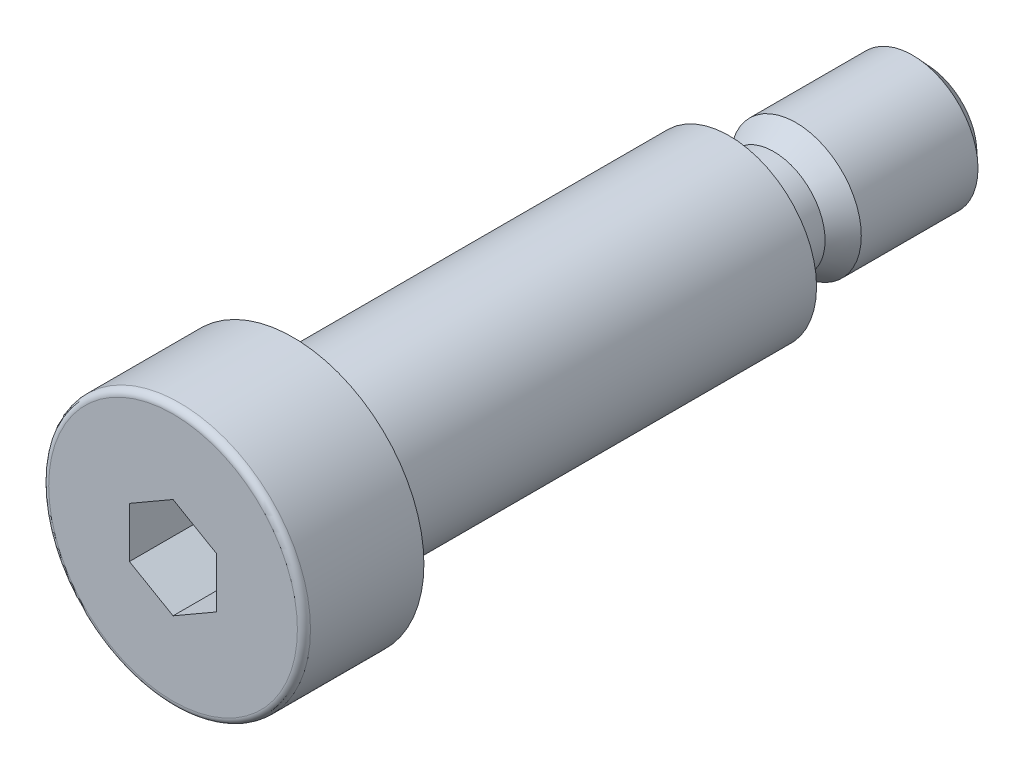
ISO-10303-21;
HEADER;
FILE_DESCRIPTION(('STEP AP214'),'2;1');
FILE_NAME('part.step','',(''),(''),'','','');
FILE_SCHEMA(('AUTOMOTIVE_DESIGN { 1 0 10303 214 1 1 1 1 }'));
ENDSEC;
DATA;
#1=APPLICATION_CONTEXT('core data for automotive mechanical design processes');
#2=APPLICATION_PROTOCOL_DEFINITION('international standard','automotive_design',2000,#1);
#3=PRODUCT_CONTEXT('',#1,'mechanical');
#4=PRODUCT('Part','Part','',(#3));
#5=PRODUCT_RELATED_PRODUCT_CATEGORY('part','',(#4));
#6=PRODUCT_DEFINITION_FORMATION('','',#4);
#7=PRODUCT_DEFINITION_CONTEXT('part definition',#1,'design');
#8=PRODUCT_DEFINITION('design','',#6,#7);
#9=PRODUCT_DEFINITION_SHAPE('','',#8);
#10=(LENGTH_UNIT() NAMED_UNIT(*) SI_UNIT(.MILLI.,.METRE.));
#11=(NAMED_UNIT(*) PLANE_ANGLE_UNIT() SI_UNIT($,.RADIAN.));
#12=(NAMED_UNIT(*) SI_UNIT($,.STERADIAN.) SOLID_ANGLE_UNIT());
#13=UNCERTAINTY_MEASURE_WITH_UNIT(LENGTH_MEASURE(1.E-05),#10,'distance_accuracy_value','');
#14=(GEOMETRIC_REPRESENTATION_CONTEXT(3) GLOBAL_UNCERTAINTY_ASSIGNED_CONTEXT((#13)) GLOBAL_UNIT_ASSIGNED_CONTEXT((#10,
#11,#12)) REPRESENTATION_CONTEXT('',''));
#15=CARTESIAN_POINT('',(0.,0.,0.));
#16=DIRECTION('',(0.,0.,1.));
#17=DIRECTION('',(1.,0.,0.));
#18=AXIS2_PLACEMENT_3D('',#15,#16,#17);
#19=CARTESIAN_POINT('',(0.,0.,31.));
#20=DIRECTION('',(0.,0.,1.));
#21=DIRECTION('',(1.,0.,0.));
#22=AXIS2_PLACEMENT_3D('',#19,#20,#21);
#23=PLANE('',#22);
#24=CARTESIAN_POINT('',(0.,0.,31.));
#25=DIRECTION('',(0.,0.,1.));
#26=DIRECTION('',(1.,0.,0.));
#27=AXIS2_PLACEMENT_3D('',#24,#25,#26);
#28=CIRCLE('',#27,11.4);
#29=CARTESIAN_POINT('',(11.4,0.,31.));
#30=VERTEX_POINT('',#29);
#31=EDGE_CURVE('E43',#30,#30,#28,.T.);
#32=ORIENTED_EDGE('',*,*,#31,.T.);
#33=EDGE_LOOP('',(#32));
#34=FACE_BOUND('',#33,.T.);
#35=DIRECTION('',(0.,1.,0.));
#36=VECTOR('',#35,1.);
#37=CARTESIAN_POINT('',(4.,-2.30940107675851,31.));
#38=LINE('',#37,#36);
#39=CARTESIAN_POINT('',(4.,-2.30940107675851,31.));
#40=VERTEX_POINT('',#39);
#41=CARTESIAN_POINT('',(4.,2.3094010767585,31.));
#42=VERTEX_POINT('',#41);
#43=EDGE_CURVE('E50',#40,#42,#38,.T.);
#44=ORIENTED_EDGE('',*,*,#43,.F.);
#45=DIRECTION('',(0.866025403784439,0.5,0.));
#46=VECTOR('',#45,1.);
#47=CARTESIAN_POINT('',(0.,-4.61880215351701,31.));
#48=LINE('',#47,#46);
#49=CARTESIAN_POINT('',(0.,-4.61880215351701,31.));
#50=VERTEX_POINT('',#49);
#51=EDGE_CURVE('E133',#50,#40,#48,.T.);
#52=ORIENTED_EDGE('',*,*,#51,.F.);
#53=DIRECTION('',(0.866025403784439,-0.5,0.));
#54=VECTOR('',#53,1.);
#55=CARTESIAN_POINT('',(-4.,-2.3094010767585,31.));
#56=LINE('',#55,#54);
#57=CARTESIAN_POINT('',(-4.,-2.3094010767585,31.));
#58=VERTEX_POINT('',#57);
#59=EDGE_CURVE('E131',#58,#50,#56,.T.);
#60=ORIENTED_EDGE('',*,*,#59,.F.);
#61=DIRECTION('',(0.,-1.,0.));
#62=VECTOR('',#61,1.);
#63=CARTESIAN_POINT('',(-4.,2.30940107675851,31.));
#64=LINE('',#63,#62);
#65=CARTESIAN_POINT('',(-4.,2.30940107675851,31.));
#66=VERTEX_POINT('',#65);
#67=EDGE_CURVE('E98',#66,#58,#64,.T.);
#68=ORIENTED_EDGE('',*,*,#67,.F.);
#69=DIRECTION('',(-0.866025403784439,-0.5,0.));
#70=VECTOR('',#69,1.);
#71=CARTESIAN_POINT('',(0.,4.61880215351701,31.));
#72=LINE('',#71,#70);
#73=CARTESIAN_POINT('',(0.,4.61880215351701,31.));
#74=VERTEX_POINT('',#73);
#75=EDGE_CURVE('E127',#74,#66,#72,.T.);
#76=ORIENTED_EDGE('',*,*,#75,.F.);
#77=DIRECTION('',(-0.866025403784439,0.5,0.));
#78=VECTOR('',#77,1.);
#79=CARTESIAN_POINT('',(4.,2.3094010767585,31.));
#80=LINE('',#79,#78);
#81=EDGE_CURVE('E124',#42,#74,#80,.T.);
#82=ORIENTED_EDGE('',*,*,#81,.F.);
#83=EDGE_LOOP('',(#44,#52,#60,#68,#76,#82));
#84=FACE_BOUND('',#83,.T.);
#85=ADVANCED_FACE('F35',(#34,#84),#23,.T.);
#86=CARTESIAN_POINT('',(0.,0.,-38.));
#87=DIRECTION('',(0.,0.,1.));
#88=DIRECTION('',(1.,0.,0.));
#89=AXIS2_PLACEMENT_3D('',#86,#87,#88);
#90=PLANE('',#89);
#91=CARTESIAN_POINT('',(0.,0.,-38.));
#92=DIRECTION('',(0.,0.,1.));
#93=DIRECTION('',(1.,0.,0.));
#94=AXIS2_PLACEMENT_3D('',#91,#92,#93);
#95=CIRCLE('',#94,4.7);
#96=CARTESIAN_POINT('',(4.7,0.,-38.));
#97=VERTEX_POINT('',#96);
#98=EDGE_CURVE('E163',#97,#97,#95,.T.);
#99=ORIENTED_EDGE('',*,*,#98,.F.);
#100=EDGE_LOOP('',(#99));
#101=FACE_BOUND('',#100,.T.);
#102=ADVANCED_FACE('F179',(#101),#90,.F.);
#103=CARTESIAN_POINT('',(0.,0.,-38.));
#104=DIRECTION('',(0.,0.,1.));
#105=DIRECTION('',(1.,0.,0.));
#106=AXIS2_PLACEMENT_3D('',#103,#104,#105);
#107=CONICAL_SURFACE('',#106,4.7,0.825376850520741);
#108=CARTESIAN_POINT('',(0.,0.,-36.8));
#109=DIRECTION('',(0.,0.,1.));
#110=DIRECTION('',(1.,0.,0.));
#111=AXIS2_PLACEMENT_3D('',#108,#109,#110);
#112=CIRCLE('',#111,6.);
#113=CARTESIAN_POINT('',(6.,0.,-36.8));
#114=VERTEX_POINT('',#113);
#115=EDGE_CURVE('E160',#114,#114,#112,.T.);
#116=ORIENTED_EDGE('',*,*,#115,.F.);
#117=EDGE_LOOP('',(#116));
#118=FACE_BOUND('',#117,.T.);
#119=ORIENTED_EDGE('',*,*,#98,.T.);
#120=EDGE_LOOP('',(#119));
#121=FACE_BOUND('',#120,.T.);
#122=ADVANCED_FACE('F183',(#118,#121),#107,.T.);
#123=CARTESIAN_POINT('',(0.,0.,31.));
#124=DIRECTION('',(0.,0.,1.));
#125=DIRECTION('',(1.,0.,0.));
#126=AXIS2_PLACEMENT_3D('',#123,#124,#125);
#127=CYLINDRICAL_SURFACE('',#126,6.);
#128=CARTESIAN_POINT('',(0.,0.,-26.1));
#129=DIRECTION('',(0.,0.,1.));
#130=DIRECTION('',(1.,0.,0.));
#131=AXIS2_PLACEMENT_3D('',#128,#129,#130);
#132=CIRCLE('',#131,6.);
#133=CARTESIAN_POINT('',(6.,0.,-26.1));
#134=VERTEX_POINT('',#133);
#135=EDGE_CURVE('E157',#134,#134,#132,.T.);
#136=ORIENTED_EDGE('',*,*,#135,.F.);
#137=EDGE_LOOP('',(#136));
#138=FACE_BOUND('',#137,.T.);
#139=ORIENTED_EDGE('',*,*,#115,.T.);
#140=EDGE_LOOP('',(#139));
#141=FACE_BOUND('',#140,.T.);
#142=ADVANCED_FACE('F189',(#138,#141),#127,.T.);
#143=CARTESIAN_POINT('',(0.,0.,-26.1));
#144=DIRECTION('',(0.,0.,-1.));
#145=DIRECTION('',(-1.,0.,0.));
#146=AXIS2_PLACEMENT_3D('',#143,#144,#145);
#147=CONICAL_SURFACE('',#146,6.,0.571837729916958);
#148=CARTESIAN_POINT('',(0.,0.,-24.08));
#149=DIRECTION('',(0.,0.,1.));
#150=DIRECTION('',(1.,0.,0.));
#151=AXIS2_PLACEMENT_3D('',#148,#149,#150);
#152=CIRCLE('',#151,4.7);
#153=CARTESIAN_POINT('',(4.7,0.,-24.08));
#154=VERTEX_POINT('',#153);
#155=EDGE_CURVE('E154',#154,#154,#152,.T.);
#156=ORIENTED_EDGE('',*,*,#155,.F.);
#157=EDGE_LOOP('',(#156));
#158=FACE_BOUND('',#157,.T.);
#159=ORIENTED_EDGE('',*,*,#135,.T.);
#160=EDGE_LOOP('',(#159));
#161=FACE_BOUND('',#160,.T.);
#162=ADVANCED_FACE('F193',(#158,#161),#147,.T.);
#163=CARTESIAN_POINT('',(0.,0.,31.));
#164=DIRECTION('',(0.,0.,1.));
#165=DIRECTION('',(1.,0.,0.));
#166=AXIS2_PLACEMENT_3D('',#163,#164,#165);
#167=CYLINDRICAL_SURFACE('',#166,4.7);
#168=ORIENTED_EDGE('',*,*,#155,.T.);
#169=EDGE_LOOP('',(#168));
#170=FACE_BOUND('',#169,.T.);
#171=CARTESIAN_POINT('',(0.,0.,-20.));
#172=DIRECTION('',(0.,0.,1.));
#173=DIRECTION('',(1.,0.,0.));
#174=AXIS2_PLACEMENT_3D('',#171,#172,#173);
#175=CIRCLE('',#174,4.7);
#176=CARTESIAN_POINT('',(4.7,0.,-20.));
#177=VERTEX_POINT('',#176);
#178=EDGE_CURVE('E151',#177,#177,#175,.T.);
#179=ORIENTED_EDGE('',*,*,#178,.F.);
#180=EDGE_LOOP('',(#179));
#181=FACE_BOUND('',#180,.T.);
#182=ADVANCED_FACE('F197',(#170,#181),#167,.T.);
#183=CARTESIAN_POINT('',(0.,0.,-20.));
#184=DIRECTION('',(0.,0.,1.));
#185=DIRECTION('',(1.,0.,0.));
#186=AXIS2_PLACEMENT_3D('',#183,#184,#185);
#187=PLANE('',#186);
#188=CARTESIAN_POINT('',(0.,0.,-20.));
#189=DIRECTION('',(0.,0.,1.));
#190=DIRECTION('',(1.,0.,0.));
#191=AXIS2_PLACEMENT_3D('',#188,#189,#190);
#192=CIRCLE('',#191,7.99999999999999);
#193=CARTESIAN_POINT('',(7.99999999999999,0.,-20.));
#194=VERTEX_POINT('',#193);
#195=EDGE_CURVE('E148',#194,#194,#192,.T.);
#196=ORIENTED_EDGE('',*,*,#195,.F.);
#197=EDGE_LOOP('',(#196));
#198=FACE_BOUND('',#197,.T.);
#199=ORIENTED_EDGE('',*,*,#178,.T.);
#200=EDGE_LOOP('',(#199));
#201=FACE_BOUND('',#200,.T.);
#202=ADVANCED_FACE('F201',(#198,#201),#187,.F.);
#203=CARTESIAN_POINT('',(0.,0.,31.));
#204=DIRECTION('',(0.,0.,1.));
#205=DIRECTION('',(1.,0.,0.));
#206=AXIS2_PLACEMENT_3D('',#203,#204,#205);
#207=CYLINDRICAL_SURFACE('',#206,7.99999999999999);
#208=ORIENTED_EDGE('',*,*,#195,.T.);
#209=EDGE_LOOP('',(#208));
#210=FACE_BOUND('',#209,.T.);
#211=CARTESIAN_POINT('',(0.,0.,20.));
#212=DIRECTION('',(0.,0.,1.));
#213=DIRECTION('',(1.,0.,0.));
#214=AXIS2_PLACEMENT_3D('',#211,#212,#213);
#215=CIRCLE('',#214,7.99999999999999);
#216=CARTESIAN_POINT('',(7.99999999999999,0.,20.));
#217=VERTEX_POINT('',#216);
#218=EDGE_CURVE('E145',#217,#217,#215,.T.);
#219=ORIENTED_EDGE('',*,*,#218,.F.);
#220=EDGE_LOOP('',(#219));
#221=FACE_BOUND('',#220,.T.);
#222=ADVANCED_FACE('F205',(#210,#221),#207,.T.);
#223=CARTESIAN_POINT('',(0.,0.,20.));
#224=DIRECTION('',(0.,0.,1.));
#225=DIRECTION('',(1.,0.,0.));
#226=AXIS2_PLACEMENT_3D('',#223,#224,#225);
#227=PLANE('',#226);
#228=CARTESIAN_POINT('',(0.,0.,20.));
#229=DIRECTION('',(0.,0.,1.));
#230=DIRECTION('',(1.,0.,0.));
#231=AXIS2_PLACEMENT_3D('',#228,#229,#230);
#232=CIRCLE('',#231,12.);
#233=CARTESIAN_POINT('',(12.,0.,20.));
#234=VERTEX_POINT('',#233);
#235=EDGE_CURVE('E137',#234,#234,#232,.T.);
#236=ORIENTED_EDGE('',*,*,#235,.F.);
#237=EDGE_LOOP('',(#236));
#238=FACE_BOUND('',#237,.T.);
#239=ORIENTED_EDGE('',*,*,#218,.T.);
#240=EDGE_LOOP('',(#239));
#241=FACE_BOUND('',#240,.T.);
#242=ADVANCED_FACE('F209',(#238,#241),#227,.F.);
#243=CARTESIAN_POINT('',(0.,0.,31.));
#244=DIRECTION('',(0.,0.,1.));
#245=DIRECTION('',(1.,0.,0.));
#246=AXIS2_PLACEMENT_3D('',#243,#244,#245);
#247=CYLINDRICAL_SURFACE('',#246,12.);
#248=CARTESIAN_POINT('',(0.,0.,30.4));
#249=DIRECTION('',(0.,0.,1.));
#250=DIRECTION('',(1.,0.,0.));
#251=AXIS2_PLACEMENT_3D('',#248,#249,#250);
#252=CIRCLE('',#251,12.);
#253=CARTESIAN_POINT('',(12.,0.,30.4));
#254=VERTEX_POINT('',#253);
#255=EDGE_CURVE('E11',#254,#254,#252,.F.);
#256=ORIENTED_EDGE('',*,*,#255,.T.);
#257=EDGE_LOOP('',(#256));
#258=FACE_BOUND('',#257,.T.);
#259=ORIENTED_EDGE('',*,*,#235,.T.);
#260=EDGE_LOOP('',(#259));
#261=FACE_BOUND('',#260,.T.);
#262=ADVANCED_FACE('F213',(#258,#261),#247,.T.);
#263=CARTESIAN_POINT('',(4.,-2.30940107675851,24.4));
#264=DIRECTION('',(1.,0.,0.));
#265=DIRECTION('',(0.,0.,-1.));
#266=AXIS2_PLACEMENT_3D('',#263,#264,#265);
#267=PLANE('',#266);
#268=ORIENTED_EDGE('',*,*,#43,.T.);
#269=DIRECTION('',(0.,0.,1.));
#270=VECTOR('',#269,1.);
#271=CARTESIAN_POINT('',(4.,2.3094010767585,24.4));
#272=LINE('',#271,#270);
#273=CARTESIAN_POINT('',(4.,2.3094010767585,24.4));
#274=VERTEX_POINT('',#273);
#275=EDGE_CURVE('E80',#274,#42,#272,.T.);
#276=ORIENTED_EDGE('',*,*,#275,.F.);
#277=DIRECTION('',(0.,1.,0.));
#278=VECTOR('',#277,1.);
#279=CARTESIAN_POINT('',(4.,-2.30940107675851,24.4));
#280=LINE('',#279,#278);
#281=CARTESIAN_POINT('',(4.,-2.30940107675851,24.4));
#282=VERTEX_POINT('',#281);
#283=EDGE_CURVE('E135',#282,#274,#280,.T.);
#284=ORIENTED_EDGE('',*,*,#283,.F.);
#285=DIRECTION('',(0.,0.,1.));
#286=VECTOR('',#285,1.);
#287=CARTESIAN_POINT('',(4.,-2.30940107675851,24.4));
#288=LINE('',#287,#286);
#289=EDGE_CURVE('E58',#282,#40,#288,.T.);
#290=ORIENTED_EDGE('',*,*,#289,.T.);
#291=EDGE_LOOP('',(#268,#276,#284,#290));
#292=FACE_BOUND('',#291,.T.);
#293=ADVANCED_FACE('F217',(#292),#267,.F.);
#294=CARTESIAN_POINT('',(0.,-4.61880215351701,24.4));
#295=DIRECTION('',(0.5,-0.866025403784439,0.));
#296=DIRECTION('',(0.866025403784439,0.5,0.));
#297=AXIS2_PLACEMENT_3D('',#294,#295,#296);
#298=PLANE('',#297);
#299=ORIENTED_EDGE('',*,*,#51,.T.);
#300=ORIENTED_EDGE('',*,*,#289,.F.);
#301=DIRECTION('',(0.866025403784439,0.5,0.));
#302=VECTOR('',#301,1.);
#303=CARTESIAN_POINT('',(0.,-4.61880215351701,24.4));
#304=LINE('',#303,#302);
#305=CARTESIAN_POINT('',(0.,-4.61880215351701,24.4));
#306=VERTEX_POINT('',#305);
#307=EDGE_CURVE('E110',#306,#282,#304,.T.);
#308=ORIENTED_EDGE('',*,*,#307,.F.);
#309=DIRECTION('',(0.,0.,1.));
#310=VECTOR('',#309,1.);
#311=CARTESIAN_POINT('',(0.,-4.61880215351701,24.4));
#312=LINE('',#311,#310);
#313=EDGE_CURVE('E102',#306,#50,#312,.T.);
#314=ORIENTED_EDGE('',*,*,#313,.T.);
#315=EDGE_LOOP('',(#299,#300,#308,#314));
#316=FACE_BOUND('',#315,.T.);
#317=ADVANCED_FACE('F221',(#316),#298,.F.);
#318=CARTESIAN_POINT('',(-4.,-2.3094010767585,24.4));
#319=DIRECTION('',(-0.5,-0.866025403784439,0.));
#320=DIRECTION('',(0.866025403784439,-0.5,0.));
#321=AXIS2_PLACEMENT_3D('',#318,#319,#320);
#322=PLANE('',#321);
#323=ORIENTED_EDGE('',*,*,#59,.T.);
#324=ORIENTED_EDGE('',*,*,#313,.F.);
#325=DIRECTION('',(0.866025403784439,-0.5,0.));
#326=VECTOR('',#325,1.);
#327=CARTESIAN_POINT('',(-4.,-2.3094010767585,24.4));
#328=LINE('',#327,#326);
#329=CARTESIAN_POINT('',(-4.,-2.3094010767585,24.4));
#330=VERTEX_POINT('',#329);
#331=EDGE_CURVE('E106',#330,#306,#328,.T.);
#332=ORIENTED_EDGE('',*,*,#331,.F.);
#333=DIRECTION('',(0.,0.,1.));
#334=VECTOR('',#333,1.);
#335=CARTESIAN_POINT('',(-4.,-2.3094010767585,24.4));
#336=LINE('',#335,#334);
#337=EDGE_CURVE('E91',#330,#58,#336,.T.);
#338=ORIENTED_EDGE('',*,*,#337,.T.);
#339=EDGE_LOOP('',(#323,#324,#332,#338));
#340=FACE_BOUND('',#339,.T.);
#341=ADVANCED_FACE('F107',(#340),#322,.F.);
#342=CARTESIAN_POINT('',(-4.,2.30940107675851,24.4));
#343=DIRECTION('',(-1.,0.,0.));
#344=DIRECTION('',(0.,-1.,0.));
#345=AXIS2_PLACEMENT_3D('',#342,#343,#344);
#346=PLANE('',#345);
#347=ORIENTED_EDGE('',*,*,#67,.T.);
#348=ORIENTED_EDGE('',*,*,#337,.F.);
#349=DIRECTION('',(0.,-1.,0.));
#350=VECTOR('',#349,1.);
#351=CARTESIAN_POINT('',(-4.,2.30940107675851,24.4));
#352=LINE('',#351,#350);
#353=CARTESIAN_POINT('',(-4.,2.30940107675851,24.4));
#354=VERTEX_POINT('',#353);
#355=EDGE_CURVE('E95',#354,#330,#352,.T.);
#356=ORIENTED_EDGE('',*,*,#355,.F.);
#357=DIRECTION('',(0.,0.,1.));
#358=VECTOR('',#357,1.);
#359=CARTESIAN_POINT('',(-4.,2.30940107675851,24.4));
#360=LINE('',#359,#358);
#361=EDGE_CURVE('E103',#354,#66,#360,.T.);
#362=ORIENTED_EDGE('',*,*,#361,.T.);
#363=EDGE_LOOP('',(#347,#348,#356,#362));
#364=FACE_BOUND('',#363,.T.);
#365=ADVANCED_FACE('F93',(#364),#346,.F.);
#366=CARTESIAN_POINT('',(0.,4.61880215351701,24.4));
#367=DIRECTION('',(-0.5,0.866025403784439,0.));
#368=DIRECTION('',(-0.866025403784439,-0.5,0.));
#369=AXIS2_PLACEMENT_3D('',#366,#367,#368);
#370=PLANE('',#369);
#371=ORIENTED_EDGE('',*,*,#75,.T.);
#372=ORIENTED_EDGE('',*,*,#361,.F.);
#373=DIRECTION('',(-0.866025403784439,-0.5,0.));
#374=VECTOR('',#373,1.);
#375=CARTESIAN_POINT('',(0.,4.61880215351701,24.4));
#376=LINE('',#375,#374);
#377=CARTESIAN_POINT('',(0.,4.61880215351701,24.4));
#378=VERTEX_POINT('',#377);
#379=EDGE_CURVE('E116',#378,#354,#376,.T.);
#380=ORIENTED_EDGE('',*,*,#379,.F.);
#381=DIRECTION('',(0.,0.,1.));
#382=VECTOR('',#381,1.);
#383=CARTESIAN_POINT('',(0.,4.61880215351701,24.4));
#384=LINE('',#383,#382);
#385=EDGE_CURVE('E140',#378,#74,#384,.T.);
#386=ORIENTED_EDGE('',*,*,#385,.T.);
#387=EDGE_LOOP('',(#371,#372,#380,#386));
#388=FACE_BOUND('',#387,.T.);
#389=ADVANCED_FACE('F224',(#388),#370,.F.);
#390=CARTESIAN_POINT('',(4.,2.3094010767585,24.4));
#391=DIRECTION('',(0.5,0.866025403784439,0.));
#392=DIRECTION('',(-0.866025403784439,0.5,0.));
#393=AXIS2_PLACEMENT_3D('',#390,#391,#392);
#394=PLANE('',#393);
#395=ORIENTED_EDGE('',*,*,#81,.T.);
#396=ORIENTED_EDGE('',*,*,#385,.F.);
#397=DIRECTION('',(-0.866025403784439,0.5,0.));
#398=VECTOR('',#397,1.);
#399=CARTESIAN_POINT('',(4.,2.3094010767585,24.4));
#400=LINE('',#399,#398);
#401=EDGE_CURVE('E118',#274,#378,#400,.T.);
#402=ORIENTED_EDGE('',*,*,#401,.F.);
#403=ORIENTED_EDGE('',*,*,#275,.T.);
#404=EDGE_LOOP('',(#395,#396,#402,#403));
#405=FACE_BOUND('',#404,.T.);
#406=ADVANCED_FACE('F175',(#405),#394,.F.);
#407=CARTESIAN_POINT('',(0.,0.,24.4));
#408=DIRECTION('',(0.,0.,1.));
#409=DIRECTION('',(1.,0.,0.));
#410=AXIS2_PLACEMENT_3D('',#407,#408,#409);
#411=PLANE('',#410);
#412=ORIENTED_EDGE('',*,*,#283,.T.);
#413=ORIENTED_EDGE('',*,*,#401,.T.);
#414=ORIENTED_EDGE('',*,*,#379,.T.);
#415=ORIENTED_EDGE('',*,*,#355,.T.);
#416=ORIENTED_EDGE('',*,*,#331,.T.);
#417=ORIENTED_EDGE('',*,*,#307,.T.);
#418=EDGE_LOOP('',(#412,#413,#414,#415,#416,#417));
#419=FACE_BOUND('',#418,.T.);
#420=ADVANCED_FACE('F113',(#419),#411,.T.);
#421=CARTESIAN_POINT('',(0.,0.,30.4));
#422=DIRECTION('',(0.,0.,1.));
#423=DIRECTION('',(1.,0.,0.));
#424=AXIS2_PLACEMENT_3D('',#421,#422,#423);
#425=TOROIDAL_SURFACE('',#424,11.4,0.6);
#426=ORIENTED_EDGE('',*,*,#255,.F.);
#427=EDGE_LOOP('',(#426));
#428=FACE_BOUND('',#427,.T.);
#429=ORIENTED_EDGE('',*,*,#31,.F.);
#430=EDGE_LOOP('',(#429));
#431=FACE_BOUND('',#430,.T.);
#432=ADVANCED_FACE('F37',(#428,#431),#425,.T.);
#433=CLOSED_SHELL('',(#85,#102,#122,#142,#162,#182,#202,#222,#242,#262,#293,#317,#341,#365,#389,
#406,#420,#432));
#434=MANIFOLD_SOLID_BREP('B2',#433);
#435=ADVANCED_BREP_SHAPE_REPRESENTATION('',(#18,#434),#14);
#436=SHAPE_DEFINITION_REPRESENTATION(#9,#435);
ENDSEC;
END-ISO-10303-21;
